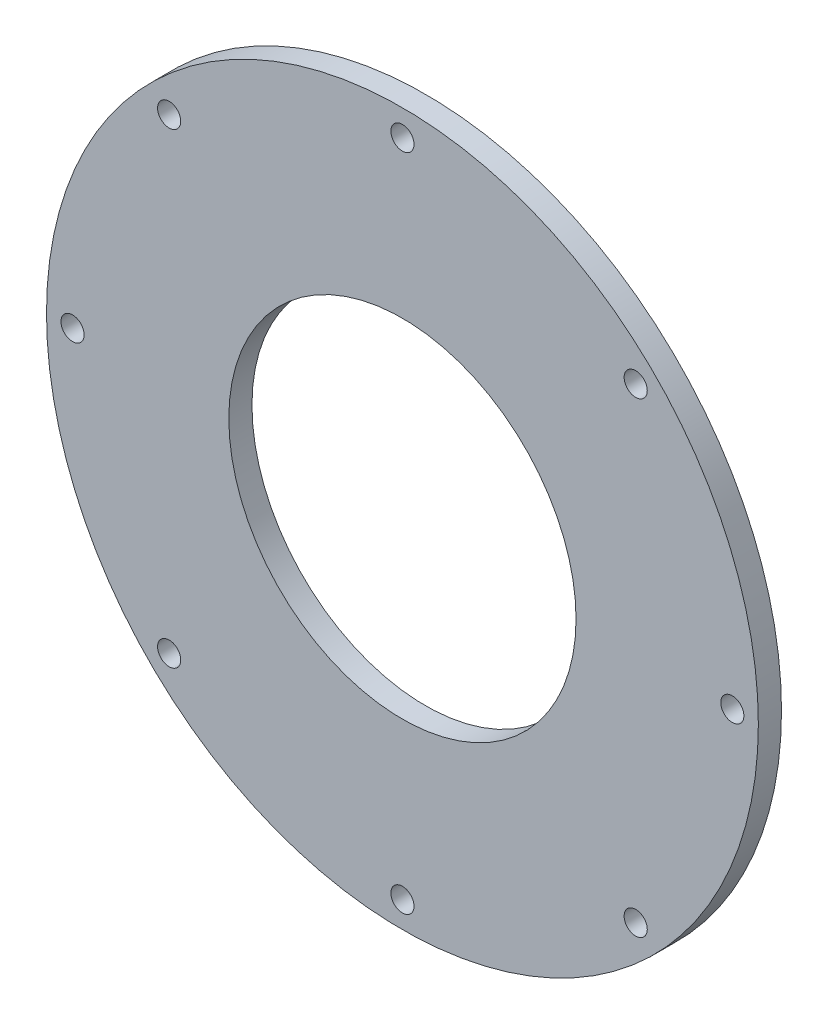
ISO-10303-21;
HEADER;
FILE_DESCRIPTION(('STEP AP214'),'2;1');
FILE_NAME('part.step','',(''),(''),'','','');
FILE_SCHEMA(('AUTOMOTIVE_DESIGN { 1 0 10303 214 1 1 1 1 }'));
ENDSEC;
DATA;
#1=APPLICATION_CONTEXT('core data for automotive mechanical design processes');
#2=APPLICATION_PROTOCOL_DEFINITION('international standard','automotive_design',2000,#1);
#3=PRODUCT_CONTEXT('',#1,'mechanical');
#4=PRODUCT('Part','Part','',(#3));
#5=PRODUCT_RELATED_PRODUCT_CATEGORY('part','',(#4));
#6=PRODUCT_DEFINITION_FORMATION('','',#4);
#7=PRODUCT_DEFINITION_CONTEXT('part definition',#1,'design');
#8=PRODUCT_DEFINITION('design','',#6,#7);
#9=PRODUCT_DEFINITION_SHAPE('','',#8);
#10=(LENGTH_UNIT() NAMED_UNIT(*) SI_UNIT(.MILLI.,.METRE.));
#11=(NAMED_UNIT(*) PLANE_ANGLE_UNIT() SI_UNIT($,.RADIAN.));
#12=(NAMED_UNIT(*) SI_UNIT($,.STERADIAN.) SOLID_ANGLE_UNIT());
#13=UNCERTAINTY_MEASURE_WITH_UNIT(LENGTH_MEASURE(1.E-05),#10,'distance_accuracy_value','');
#14=(GEOMETRIC_REPRESENTATION_CONTEXT(3) GLOBAL_UNCERTAINTY_ASSIGNED_CONTEXT((#13)) GLOBAL_UNIT_ASSIGNED_CONTEXT((#10,
#11,#12)) REPRESENTATION_CONTEXT('',''));
#15=CARTESIAN_POINT('',(0.,0.,0.));
#16=DIRECTION('',(0.,0.,1.));
#17=DIRECTION('',(1.,0.,0.));
#18=AXIS2_PLACEMENT_3D('',#15,#16,#17);
#19=CARTESIAN_POINT('',(0.,0.,4.));
#20=DIRECTION('',(0.,0.,1.));
#21=DIRECTION('',(1.,0.,0.));
#22=AXIS2_PLACEMENT_3D('',#19,#20,#21);
#23=PLANE('',#22);
#24=CARTESIAN_POINT('',(0.,0.,4.));
#25=DIRECTION('',(0.,0.,1.));
#26=DIRECTION('',(1.,0.,0.));
#27=AXIS2_PLACEMENT_3D('',#24,#25,#26);
#28=CIRCLE('',#27,30.);
#29=CARTESIAN_POINT('',(30.,0.,4.));
#30=VERTEX_POINT('',#29);
#31=EDGE_CURVE('E117',#30,#30,#28,.T.);
#32=ORIENTED_EDGE('',*,*,#31,.F.);
#33=EDGE_LOOP('',(#32));
#34=FACE_BOUND('',#33,.T.);
#35=CARTESIAN_POINT('',(57.,-5.96492217882559E-13,4.));
#36=DIRECTION('',(0.,0.,1.));
#37=DIRECTION('',(1.,0.,0.));
#38=AXIS2_PLACEMENT_3D('',#35,#36,#37);
#39=CIRCLE('',#38,2.);
#40=CARTESIAN_POINT('',(59.,-5.96492217882559E-13,4.));
#41=VERTEX_POINT('',#40);
#42=EDGE_CURVE('E98',#41,#41,#39,.T.);
#43=ORIENTED_EDGE('',*,*,#42,.F.);
#44=EDGE_LOOP('',(#43));
#45=FACE_BOUND('',#44,.T.);
#46=CARTESIAN_POINT('',(3.97477781568501E-13,57.,4.));
#47=DIRECTION('',(0.,0.,1.));
#48=DIRECTION('',(1.,0.,0.));
#49=AXIS2_PLACEMENT_3D('',#46,#47,#48);
#50=CIRCLE('',#49,2.);
#51=CARTESIAN_POINT('',(2.0000000000004,57.,4.));
#52=VERTEX_POINT('',#51);
#53=EDGE_CURVE('E82',#52,#52,#50,.T.);
#54=ORIENTED_EDGE('',*,*,#53,.F.);
#55=EDGE_LOOP('',(#54));
#56=FACE_BOUND('',#55,.T.);
#57=CARTESIAN_POINT('',(-57.,1.00835959934104E-12,4.));
#58=DIRECTION('',(0.,0.,1.));
#59=DIRECTION('',(1.,0.,0.));
#60=AXIS2_PLACEMENT_3D('',#57,#58,#59);
#61=CIRCLE('',#60,2.);
#62=CARTESIAN_POINT('',(-55.,1.00835959934104E-12,4.));
#63=VERTEX_POINT('',#62);
#64=EDGE_CURVE('E66',#63,#63,#61,.T.);
#65=ORIENTED_EDGE('',*,*,#64,.F.);
#66=EDGE_LOOP('',(#65));
#67=FACE_BOUND('',#66,.T.);
#68=CARTESIAN_POINT('',(0.,-57.,4.));
#69=DIRECTION('',(0.,0.,1.));
#70=DIRECTION('',(1.,0.,0.));
#71=AXIS2_PLACEMENT_3D('',#68,#69,#70);
#72=CIRCLE('',#71,2.);
#73=CARTESIAN_POINT('',(2.,-57.,4.));
#74=VERTEX_POINT('',#73);
#75=EDGE_CURVE('E52',#74,#74,#72,.T.);
#76=ORIENTED_EDGE('',*,*,#75,.F.);
#77=EDGE_LOOP('',(#76));
#78=FACE_BOUND('',#77,.T.);
#79=CARTESIAN_POINT('',(0.,0.,4.));
#80=DIRECTION('',(0.,0.,1.));
#81=DIRECTION('',(1.,0.,0.));
#82=AXIS2_PLACEMENT_3D('',#79,#80,#81);
#83=CIRCLE('',#82,61.5);
#84=CARTESIAN_POINT('',(61.5,0.,4.));
#85=VERTEX_POINT('',#84);
#86=EDGE_CURVE('E10',#85,#85,#83,.T.);
#87=ORIENTED_EDGE('',*,*,#86,.T.);
#88=EDGE_LOOP('',(#87));
#89=FACE_BOUND('',#88,.T.);
#90=CARTESIAN_POINT('',(-40.3050865276338,-40.3050865276326,4.));
#91=DIRECTION('',(0.,0.,1.));
#92=DIRECTION('',(1.,0.,0.));
#93=AXIS2_PLACEMENT_3D('',#90,#91,#92);
#94=CIRCLE('',#93,2.00000000000001);
#95=CARTESIAN_POINT('',(-38.3050865276338,-40.3050865276326,4.));
#96=VERTEX_POINT('',#95);
#97=EDGE_CURVE('E58',#96,#96,#94,.T.);
#98=ORIENTED_EDGE('',*,*,#97,.F.);
#99=EDGE_LOOP('',(#98));
#100=FACE_BOUND('',#99,.T.);
#101=CARTESIAN_POINT('',(-40.305086527633,40.3050865276334,4.));
#102=DIRECTION('',(0.,0.,1.));
#103=DIRECTION('',(1.,0.,0.));
#104=AXIS2_PLACEMENT_3D('',#101,#102,#103);
#105=CIRCLE('',#104,2.00000000000001);
#106=CARTESIAN_POINT('',(-38.305086527633,40.3050865276334,4.));
#107=VERTEX_POINT('',#106);
#108=EDGE_CURVE('E74',#107,#107,#105,.T.);
#109=ORIENTED_EDGE('',*,*,#108,.F.);
#110=EDGE_LOOP('',(#109));
#111=FACE_BOUND('',#110,.T.);
#112=CARTESIAN_POINT('',(40.3050865276336,40.3050865276329,4.));
#113=DIRECTION('',(0.,0.,1.));
#114=DIRECTION('',(1.,0.,0.));
#115=AXIS2_PLACEMENT_3D('',#112,#113,#114);
#116=CIRCLE('',#115,2.00000000000001);
#117=CARTESIAN_POINT('',(42.3050865276336,40.3050865276329,4.));
#118=VERTEX_POINT('',#117);
#119=EDGE_CURVE('E90',#118,#118,#116,.T.);
#120=ORIENTED_EDGE('',*,*,#119,.F.);
#121=EDGE_LOOP('',(#120));
#122=FACE_BOUND('',#121,.T.);
#123=CARTESIAN_POINT('',(40.3050865276327,-40.3050865276337,4.));
#124=DIRECTION('',(0.,0.,1.));
#125=DIRECTION('',(1.,0.,0.));
#126=AXIS2_PLACEMENT_3D('',#123,#124,#125);
#127=CIRCLE('',#126,2.00000000000001);
#128=CARTESIAN_POINT('',(42.3050865276327,-40.3050865276337,4.));
#129=VERTEX_POINT('',#128);
#130=EDGE_CURVE('E106',#129,#129,#127,.T.);
#131=ORIENTED_EDGE('',*,*,#130,.F.);
#132=EDGE_LOOP('',(#131));
#133=FACE_BOUND('',#132,.T.);
#134=ADVANCED_FACE('F37',(#34,#45,#56,#67,#78,#89,#100,#111,#122,#133),#23,.T.);
#135=CARTESIAN_POINT('',(0.,0.,0.));
#136=DIRECTION('',(0.,0.,1.));
#137=DIRECTION('',(1.,0.,0.));
#138=AXIS2_PLACEMENT_3D('',#135,#136,#137);
#139=PLANE('',#138);
#140=CARTESIAN_POINT('',(0.,0.,0.));
#141=DIRECTION('',(0.,0.,1.));
#142=DIRECTION('',(1.,0.,0.));
#143=AXIS2_PLACEMENT_3D('',#140,#141,#142);
#144=CIRCLE('',#143,30.);
#145=CARTESIAN_POINT('',(30.,0.,0.));
#146=VERTEX_POINT('',#145);
#147=EDGE_CURVE('E41',#146,#146,#144,.T.);
#148=ORIENTED_EDGE('',*,*,#147,.T.);
#149=EDGE_LOOP('',(#148));
#150=FACE_BOUND('',#149,.T.);
#151=CARTESIAN_POINT('',(0.,0.,0.));
#152=DIRECTION('',(0.,0.,1.));
#153=DIRECTION('',(1.,0.,0.));
#154=AXIS2_PLACEMENT_3D('',#151,#152,#153);
#155=CIRCLE('',#154,61.5);
#156=CARTESIAN_POINT('',(61.5,0.,0.));
#157=VERTEX_POINT('',#156);
#158=EDGE_CURVE('E46',#157,#157,#155,.T.);
#159=ORIENTED_EDGE('',*,*,#158,.F.);
#160=EDGE_LOOP('',(#159));
#161=FACE_BOUND('',#160,.T.);
#162=CARTESIAN_POINT('',(0.,-57.,0.));
#163=DIRECTION('',(0.,0.,1.));
#164=DIRECTION('',(1.,0.,0.));
#165=AXIS2_PLACEMENT_3D('',#162,#163,#164);
#166=CIRCLE('',#165,2.);
#167=CARTESIAN_POINT('',(2.,-57.,0.));
#168=VERTEX_POINT('',#167);
#169=EDGE_CURVE('E54',#168,#168,#166,.T.);
#170=ORIENTED_EDGE('',*,*,#169,.T.);
#171=EDGE_LOOP('',(#170));
#172=FACE_BOUND('',#171,.T.);
#173=CARTESIAN_POINT('',(-40.3050865276338,-40.3050865276326,0.));
#174=DIRECTION('',(0.,0.,1.));
#175=DIRECTION('',(1.,0.,0.));
#176=AXIS2_PLACEMENT_3D('',#173,#174,#175);
#177=CIRCLE('',#176,2.00000000000001);
#178=CARTESIAN_POINT('',(-38.3050865276338,-40.3050865276326,0.));
#179=VERTEX_POINT('',#178);
#180=EDGE_CURVE('E62',#179,#179,#177,.T.);
#181=ORIENTED_EDGE('',*,*,#180,.T.);
#182=EDGE_LOOP('',(#181));
#183=FACE_BOUND('',#182,.T.);
#184=CARTESIAN_POINT('',(-57.,1.00835959934104E-12,0.));
#185=DIRECTION('',(0.,0.,1.));
#186=DIRECTION('',(1.,0.,0.));
#187=AXIS2_PLACEMENT_3D('',#184,#185,#186);
#188=CIRCLE('',#187,2.);
#189=CARTESIAN_POINT('',(-55.,1.00835959934104E-12,0.));
#190=VERTEX_POINT('',#189);
#191=EDGE_CURVE('E70',#190,#190,#188,.T.);
#192=ORIENTED_EDGE('',*,*,#191,.T.);
#193=EDGE_LOOP('',(#192));
#194=FACE_BOUND('',#193,.T.);
#195=CARTESIAN_POINT('',(-40.305086527633,40.3050865276334,0.));
#196=DIRECTION('',(0.,0.,1.));
#197=DIRECTION('',(1.,0.,0.));
#198=AXIS2_PLACEMENT_3D('',#195,#196,#197);
#199=CIRCLE('',#198,2.00000000000001);
#200=CARTESIAN_POINT('',(-38.305086527633,40.3050865276334,0.));
#201=VERTEX_POINT('',#200);
#202=EDGE_CURVE('E78',#201,#201,#199,.T.);
#203=ORIENTED_EDGE('',*,*,#202,.T.);
#204=EDGE_LOOP('',(#203));
#205=FACE_BOUND('',#204,.T.);
#206=CARTESIAN_POINT('',(3.97477781568501E-13,57.,0.));
#207=DIRECTION('',(0.,0.,1.));
#208=DIRECTION('',(1.,0.,0.));
#209=AXIS2_PLACEMENT_3D('',#206,#207,#208);
#210=CIRCLE('',#209,2.);
#211=CARTESIAN_POINT('',(2.0000000000004,57.,0.));
#212=VERTEX_POINT('',#211);
#213=EDGE_CURVE('E86',#212,#212,#210,.T.);
#214=ORIENTED_EDGE('',*,*,#213,.T.);
#215=EDGE_LOOP('',(#214));
#216=FACE_BOUND('',#215,.T.);
#217=CARTESIAN_POINT('',(40.3050865276336,40.3050865276329,0.));
#218=DIRECTION('',(0.,0.,1.));
#219=DIRECTION('',(1.,0.,0.));
#220=AXIS2_PLACEMENT_3D('',#217,#218,#219);
#221=CIRCLE('',#220,2.00000000000001);
#222=CARTESIAN_POINT('',(42.3050865276336,40.3050865276329,0.));
#223=VERTEX_POINT('',#222);
#224=EDGE_CURVE('E94',#223,#223,#221,.T.);
#225=ORIENTED_EDGE('',*,*,#224,.T.);
#226=EDGE_LOOP('',(#225));
#227=FACE_BOUND('',#226,.T.);
#228=CARTESIAN_POINT('',(57.,-5.96492217882559E-13,0.));
#229=DIRECTION('',(0.,0.,1.));
#230=DIRECTION('',(1.,0.,0.));
#231=AXIS2_PLACEMENT_3D('',#228,#229,#230);
#232=CIRCLE('',#231,2.);
#233=CARTESIAN_POINT('',(59.,-5.96492217882559E-13,0.));
#234=VERTEX_POINT('',#233);
#235=EDGE_CURVE('E102',#234,#234,#232,.T.);
#236=ORIENTED_EDGE('',*,*,#235,.T.);
#237=EDGE_LOOP('',(#236));
#238=FACE_BOUND('',#237,.T.);
#239=CARTESIAN_POINT('',(40.3050865276327,-40.3050865276337,0.));
#240=DIRECTION('',(0.,0.,1.));
#241=DIRECTION('',(1.,0.,0.));
#242=AXIS2_PLACEMENT_3D('',#239,#240,#241);
#243=CIRCLE('',#242,2.00000000000001);
#244=CARTESIAN_POINT('',(42.3050865276327,-40.3050865276337,0.));
#245=VERTEX_POINT('',#244);
#246=EDGE_CURVE('E110',#245,#245,#243,.T.);
#247=ORIENTED_EDGE('',*,*,#246,.T.);
#248=EDGE_LOOP('',(#247));
#249=FACE_BOUND('',#248,.T.);
#250=ADVANCED_FACE('F126',(#150,#161,#172,#183,#194,#205,#216,#227,#238,#249),#139,.F.);
#251=CARTESIAN_POINT('',(0.,0.,4.));
#252=DIRECTION('',(0.,0.,-1.));
#253=DIRECTION('',(-1.,0.,0.));
#254=AXIS2_PLACEMENT_3D('',#251,#252,#253);
#255=CYLINDRICAL_SURFACE('',#254,61.5);
#256=ORIENTED_EDGE('',*,*,#86,.F.);
#257=EDGE_LOOP('',(#256));
#258=FACE_BOUND('',#257,.T.);
#259=ORIENTED_EDGE('',*,*,#158,.T.);
#260=EDGE_LOOP('',(#259));
#261=FACE_BOUND('',#260,.T.);
#262=ADVANCED_FACE('F39',(#258,#261),#255,.T.);
#263=CARTESIAN_POINT('',(0.,-57.,4.));
#264=DIRECTION('',(0.,0.,-1.));
#265=DIRECTION('',(-1.,0.,0.));
#266=AXIS2_PLACEMENT_3D('',#263,#264,#265);
#267=CYLINDRICAL_SURFACE('',#266,2.);
#268=ORIENTED_EDGE('',*,*,#75,.T.);
#269=EDGE_LOOP('',(#268));
#270=FACE_BOUND('',#269,.T.);
#271=ORIENTED_EDGE('',*,*,#169,.F.);
#272=EDGE_LOOP('',(#271));
#273=FACE_BOUND('',#272,.T.);
#274=ADVANCED_FACE('F147',(#270,#273),#267,.F.);
#275=CARTESIAN_POINT('',(-40.3050865276338,-40.3050865276326,4.));
#276=DIRECTION('',(0.,0.,-1.));
#277=DIRECTION('',(-1.,0.,0.));
#278=AXIS2_PLACEMENT_3D('',#275,#276,#277);
#279=CYLINDRICAL_SURFACE('',#278,2.00000000000001);
#280=ORIENTED_EDGE('',*,*,#97,.T.);
#281=EDGE_LOOP('',(#280));
#282=FACE_BOUND('',#281,.T.);
#283=ORIENTED_EDGE('',*,*,#180,.F.);
#284=EDGE_LOOP('',(#283));
#285=FACE_BOUND('',#284,.T.);
#286=ADVANCED_FACE('F150',(#282,#285),#279,.F.);
#287=CARTESIAN_POINT('',(-57.,1.00835959934104E-12,4.));
#288=DIRECTION('',(0.,0.,-1.));
#289=DIRECTION('',(-1.,0.,0.));
#290=AXIS2_PLACEMENT_3D('',#287,#288,#289);
#291=CYLINDRICAL_SURFACE('',#290,2.);
#292=ORIENTED_EDGE('',*,*,#64,.T.);
#293=EDGE_LOOP('',(#292));
#294=FACE_BOUND('',#293,.T.);
#295=ORIENTED_EDGE('',*,*,#191,.F.);
#296=EDGE_LOOP('',(#295));
#297=FACE_BOUND('',#296,.T.);
#298=ADVANCED_FACE('F154',(#294,#297),#291,.F.);
#299=CARTESIAN_POINT('',(-40.305086527633,40.3050865276334,4.));
#300=DIRECTION('',(0.,0.,-1.));
#301=DIRECTION('',(-1.,0.,0.));
#302=AXIS2_PLACEMENT_3D('',#299,#300,#301);
#303=CYLINDRICAL_SURFACE('',#302,2.00000000000001);
#304=ORIENTED_EDGE('',*,*,#108,.T.);
#305=EDGE_LOOP('',(#304));
#306=FACE_BOUND('',#305,.T.);
#307=ORIENTED_EDGE('',*,*,#202,.F.);
#308=EDGE_LOOP('',(#307));
#309=FACE_BOUND('',#308,.T.);
#310=ADVANCED_FACE('F158',(#306,#309),#303,.F.);
#311=CARTESIAN_POINT('',(3.97477781568501E-13,57.,4.));
#312=DIRECTION('',(0.,0.,-1.));
#313=DIRECTION('',(-1.,0.,0.));
#314=AXIS2_PLACEMENT_3D('',#311,#312,#313);
#315=CYLINDRICAL_SURFACE('',#314,2.);
#316=ORIENTED_EDGE('',*,*,#53,.T.);
#317=EDGE_LOOP('',(#316));
#318=FACE_BOUND('',#317,.T.);
#319=ORIENTED_EDGE('',*,*,#213,.F.);
#320=EDGE_LOOP('',(#319));
#321=FACE_BOUND('',#320,.T.);
#322=ADVANCED_FACE('F162',(#318,#321),#315,.F.);
#323=CARTESIAN_POINT('',(40.3050865276336,40.3050865276329,4.));
#324=DIRECTION('',(0.,0.,-1.));
#325=DIRECTION('',(-1.,0.,0.));
#326=AXIS2_PLACEMENT_3D('',#323,#324,#325);
#327=CYLINDRICAL_SURFACE('',#326,2.00000000000001);
#328=ORIENTED_EDGE('',*,*,#119,.T.);
#329=EDGE_LOOP('',(#328));
#330=FACE_BOUND('',#329,.T.);
#331=ORIENTED_EDGE('',*,*,#224,.F.);
#332=EDGE_LOOP('',(#331));
#333=FACE_BOUND('',#332,.T.);
#334=ADVANCED_FACE('F166',(#330,#333),#327,.F.);
#335=CARTESIAN_POINT('',(57.,-5.96492217882559E-13,4.));
#336=DIRECTION('',(0.,0.,-1.));
#337=DIRECTION('',(-1.,0.,0.));
#338=AXIS2_PLACEMENT_3D('',#335,#336,#337);
#339=CYLINDRICAL_SURFACE('',#338,2.);
#340=ORIENTED_EDGE('',*,*,#42,.T.);
#341=EDGE_LOOP('',(#340));
#342=FACE_BOUND('',#341,.T.);
#343=ORIENTED_EDGE('',*,*,#235,.F.);
#344=EDGE_LOOP('',(#343));
#345=FACE_BOUND('',#344,.T.);
#346=ADVANCED_FACE('F136',(#342,#345),#339,.F.);
#347=CARTESIAN_POINT('',(40.3050865276327,-40.3050865276337,4.));
#348=DIRECTION('',(0.,0.,-1.));
#349=DIRECTION('',(-1.,0.,0.));
#350=AXIS2_PLACEMENT_3D('',#347,#348,#349);
#351=CYLINDRICAL_SURFACE('',#350,2.00000000000001);
#352=ORIENTED_EDGE('',*,*,#130,.T.);
#353=EDGE_LOOP('',(#352));
#354=FACE_BOUND('',#353,.T.);
#355=ORIENTED_EDGE('',*,*,#246,.F.);
#356=EDGE_LOOP('',(#355));
#357=FACE_BOUND('',#356,.T.);
#358=ADVANCED_FACE('F131',(#354,#357),#351,.F.);
#359=CARTESIAN_POINT('',(0.,0.,-6.));
#360=DIRECTION('',(0.,0.,1.));
#361=DIRECTION('',(1.,0.,0.));
#362=AXIS2_PLACEMENT_3D('',#359,#360,#361);
#363=CYLINDRICAL_SURFACE('',#362,30.);
#364=ORIENTED_EDGE('',*,*,#31,.T.);
#365=EDGE_LOOP('',(#364));
#366=FACE_BOUND('',#365,.T.);
#367=ORIENTED_EDGE('',*,*,#147,.F.);
#368=EDGE_LOOP('',(#367));
#369=FACE_BOUND('',#368,.T.);
#370=ADVANCED_FACE('F129',(#366,#369),#363,.F.);
#371=CLOSED_SHELL('',(#134,#250,#262,#274,#286,#298,#310,#322,#334,#346,#358,#370));
#372=MANIFOLD_SOLID_BREP('B2',#371);
#373=ADVANCED_BREP_SHAPE_REPRESENTATION('',(#18,#372),#14);
#374=SHAPE_DEFINITION_REPRESENTATION(#9,#373);
ENDSEC;
END-ISO-10303-21;
